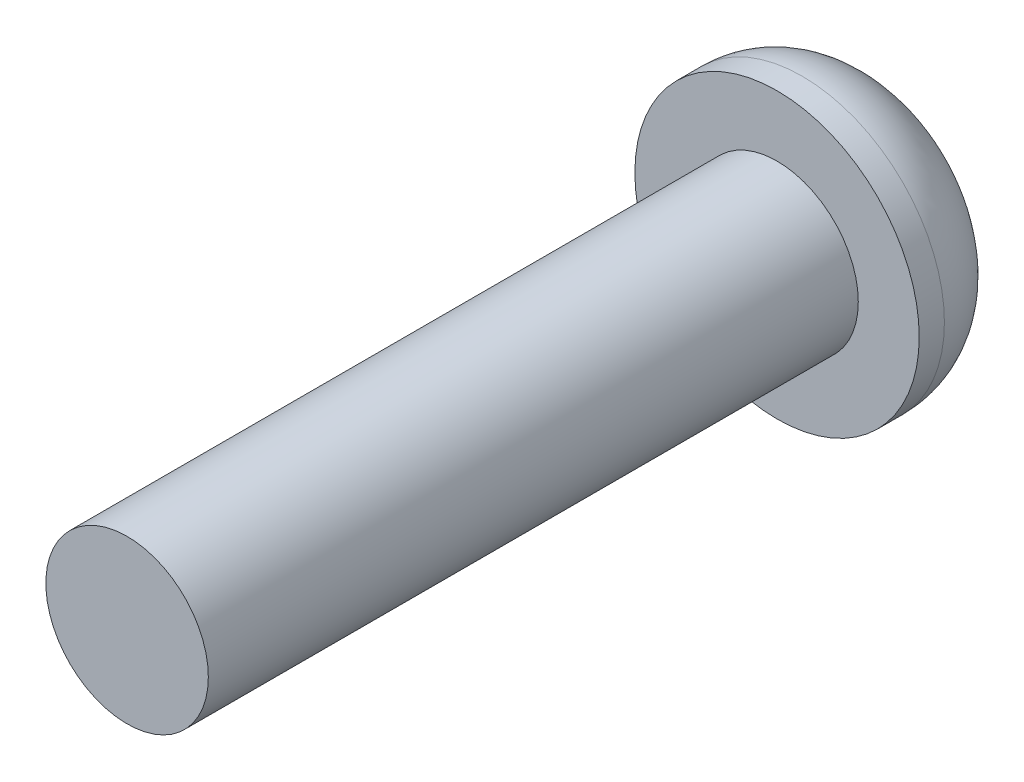
ISO-10303-21;
HEADER;
FILE_DESCRIPTION(('STEP AP214'),'2;1');
FILE_NAME('part.step','',(''),(''),'','','');
FILE_SCHEMA(('AUTOMOTIVE_DESIGN { 1 0 10303 214 1 1 1 1 }'));
ENDSEC;
DATA;
#1=APPLICATION_CONTEXT('core data for automotive mechanical design processes');
#2=APPLICATION_PROTOCOL_DEFINITION('international standard','automotive_design',2000,#1);
#3=PRODUCT_CONTEXT('',#1,'mechanical');
#4=PRODUCT('Part','Part','',(#3));
#5=PRODUCT_RELATED_PRODUCT_CATEGORY('part','',(#4));
#6=PRODUCT_DEFINITION_FORMATION('','',#4);
#7=PRODUCT_DEFINITION_CONTEXT('part definition',#1,'design');
#8=PRODUCT_DEFINITION('design','',#6,#7);
#9=PRODUCT_DEFINITION_SHAPE('','',#8);
#10=(LENGTH_UNIT() NAMED_UNIT(*) SI_UNIT(.MILLI.,.METRE.));
#11=(NAMED_UNIT(*) PLANE_ANGLE_UNIT() SI_UNIT($,.RADIAN.));
#12=(NAMED_UNIT(*) SI_UNIT($,.STERADIAN.) SOLID_ANGLE_UNIT());
#13=UNCERTAINTY_MEASURE_WITH_UNIT(LENGTH_MEASURE(1.E-05),#10,'distance_accuracy_value','');
#14=(GEOMETRIC_REPRESENTATION_CONTEXT(3) GLOBAL_UNCERTAINTY_ASSIGNED_CONTEXT((#13)) GLOBAL_UNIT_ASSIGNED_CONTEXT((#10,
#11,#12)) REPRESENTATION_CONTEXT('',''));
#15=CARTESIAN_POINT('',(0.,0.,0.));
#16=DIRECTION('',(0.,0.,1.));
#17=DIRECTION('',(1.,0.,0.));
#18=AXIS2_PLACEMENT_3D('',#15,#16,#17);
#19=CARTESIAN_POINT('',(0.,0.,8.));
#20=DIRECTION('',(0.,0.,-1.));
#21=DIRECTION('',(-1.,0.,0.));
#22=AXIS2_PLACEMENT_3D('',#19,#20,#21);
#23=CYLINDRICAL_SURFACE('',#22,1.);
#24=CARTESIAN_POINT('',(0.,0.,8.));
#25=DIRECTION('',(0.,0.,1.));
#26=DIRECTION('',(1.,0.,0.));
#27=AXIS2_PLACEMENT_3D('',#24,#25,#26);
#28=CIRCLE('',#27,1.);
#29=CARTESIAN_POINT('',(1.,0.,8.));
#30=VERTEX_POINT('',#29);
#31=EDGE_CURVE('E50',#30,#30,#28,.T.);
#32=ORIENTED_EDGE('',*,*,#31,.F.);
#33=EDGE_LOOP('',(#32));
#34=FACE_BOUND('',#33,.T.);
#35=CARTESIAN_POINT('',(0.,0.,0.));
#36=DIRECTION('',(0.,0.,1.));
#37=DIRECTION('',(1.,0.,0.));
#38=AXIS2_PLACEMENT_3D('',#35,#36,#37);
#39=CIRCLE('',#38,1.);
#40=CARTESIAN_POINT('',(1.,0.,0.));
#41=VERTEX_POINT('',#40);
#42=EDGE_CURVE('E55',#41,#41,#39,.T.);
#43=ORIENTED_EDGE('',*,*,#42,.T.);
#44=EDGE_LOOP('',(#43));
#45=FACE_BOUND('',#44,.T.);
#46=ADVANCED_FACE('F37',(#34,#45),#23,.T.);
#47=CARTESIAN_POINT('',(0.,0.,8.));
#48=DIRECTION('',(0.,0.,1.));
#49=DIRECTION('',(1.,0.,0.));
#50=AXIS2_PLACEMENT_3D('',#47,#48,#49);
#51=PLANE('',#50);
#52=ORIENTED_EDGE('',*,*,#31,.T.);
#53=EDGE_LOOP('',(#52));
#54=FACE_BOUND('',#53,.T.);
#55=ADVANCED_FACE('F82',(#54),#51,.T.);
#56=CARTESIAN_POINT('',(0.,0.,-1.31));
#57=DIRECTION('',(0.,0.,1.));
#58=DIRECTION('',(1.,0.,0.));
#59=AXIS2_PLACEMENT_3D('',#56,#57,#58);
#60=CYLINDRICAL_SURFACE('',#59,1.75);
#61=CARTESIAN_POINT('',(0.,0.,-0.31));
#62=DIRECTION('',(0.,0.,-1.));
#63=DIRECTION('',(-1.,0.,0.));
#64=AXIS2_PLACEMENT_3D('',#61,#62,#63);
#65=CIRCLE('',#64,1.75);
#66=CARTESIAN_POINT('',(-1.75,0.,-0.31));
#67=VERTEX_POINT('',#66);
#68=EDGE_CURVE('E10',#67,#67,#65,.F.);
#69=ORIENTED_EDGE('',*,*,#68,.T.);
#70=EDGE_LOOP('',(#69));
#71=FACE_BOUND('',#70,.T.);
#72=CARTESIAN_POINT('',(0.,0.,0.));
#73=DIRECTION('',(0.,0.,-1.));
#74=DIRECTION('',(-1.,0.,0.));
#75=AXIS2_PLACEMENT_3D('',#72,#73,#74);
#76=CIRCLE('',#75,1.75);
#77=CARTESIAN_POINT('',(-1.75,0.,0.));
#78=VERTEX_POINT('',#77);
#79=EDGE_CURVE('E60',#78,#78,#76,.T.);
#80=ORIENTED_EDGE('',*,*,#79,.T.);
#81=EDGE_LOOP('',(#80));
#82=FACE_BOUND('',#81,.T.);
#83=ADVANCED_FACE('F66',(#71,#82),#60,.T.);
#84=CARTESIAN_POINT('',(0.,0.,-1.31));
#85=DIRECTION('',(0.,0.,-1.));
#86=DIRECTION('',(-1.,0.,0.));
#87=AXIS2_PLACEMENT_3D('',#84,#85,#86);
#88=PLANE('',#87);
#89=CARTESIAN_POINT('',(0.,0.,-1.31));
#90=DIRECTION('',(0.,0.,-1.));
#91=DIRECTION('',(-1.,0.,0.));
#92=AXIS2_PLACEMENT_3D('',#89,#90,#91);
#93=CIRCLE('',#92,0.75);
#94=CARTESIAN_POINT('',(-0.75,0.,-1.31));
#95=VERTEX_POINT('',#94);
#96=EDGE_CURVE('E45',#95,#95,#93,.T.);
#97=ORIENTED_EDGE('',*,*,#96,.T.);
#98=EDGE_LOOP('',(#97));
#99=FACE_BOUND('',#98,.T.);
#100=ADVANCED_FACE('F70',(#99),#88,.T.);
#101=CARTESIAN_POINT('',(0.,0.,0.));
#102=DIRECTION('',(0.,0.,-1.));
#103=DIRECTION('',(-1.,0.,0.));
#104=AXIS2_PLACEMENT_3D('',#101,#102,#103);
#105=PLANE('',#104);
#106=ORIENTED_EDGE('',*,*,#42,.F.);
#107=EDGE_LOOP('',(#106));
#108=FACE_BOUND('',#107,.T.);
#109=ORIENTED_EDGE('',*,*,#79,.F.);
#110=EDGE_LOOP('',(#109));
#111=FACE_BOUND('',#110,.T.);
#112=ADVANCED_FACE('F68',(#108,#111),#105,.F.);
#113=CARTESIAN_POINT('',(0.,0.,-0.31));
#114=DIRECTION('',(0.,0.,-1.));
#115=DIRECTION('',(-1.,0.,0.));
#116=AXIS2_PLACEMENT_3D('',#113,#114,#115);
#117=DEGENERATE_TOROIDAL_SURFACE('',#116,0.75,1.,.T.);
#118=ORIENTED_EDGE('',*,*,#68,.F.);
#119=EDGE_LOOP('',(#118));
#120=FACE_BOUND('',#119,.T.);
#121=ORIENTED_EDGE('',*,*,#96,.F.);
#122=EDGE_LOOP('',(#121));
#123=FACE_BOUND('',#122,.T.);
#124=ADVANCED_FACE('F39',(#120,#123),#117,.T.);
#125=CLOSED_SHELL('',(#46,#55,#83,#100,#112,#124));
#126=MANIFOLD_SOLID_BREP('B2',#125);
#127=ADVANCED_BREP_SHAPE_REPRESENTATION('',(#18,#126),#14);
#128=SHAPE_DEFINITION_REPRESENTATION(#9,#127);
ENDSEC;
END-ISO-10303-21;
